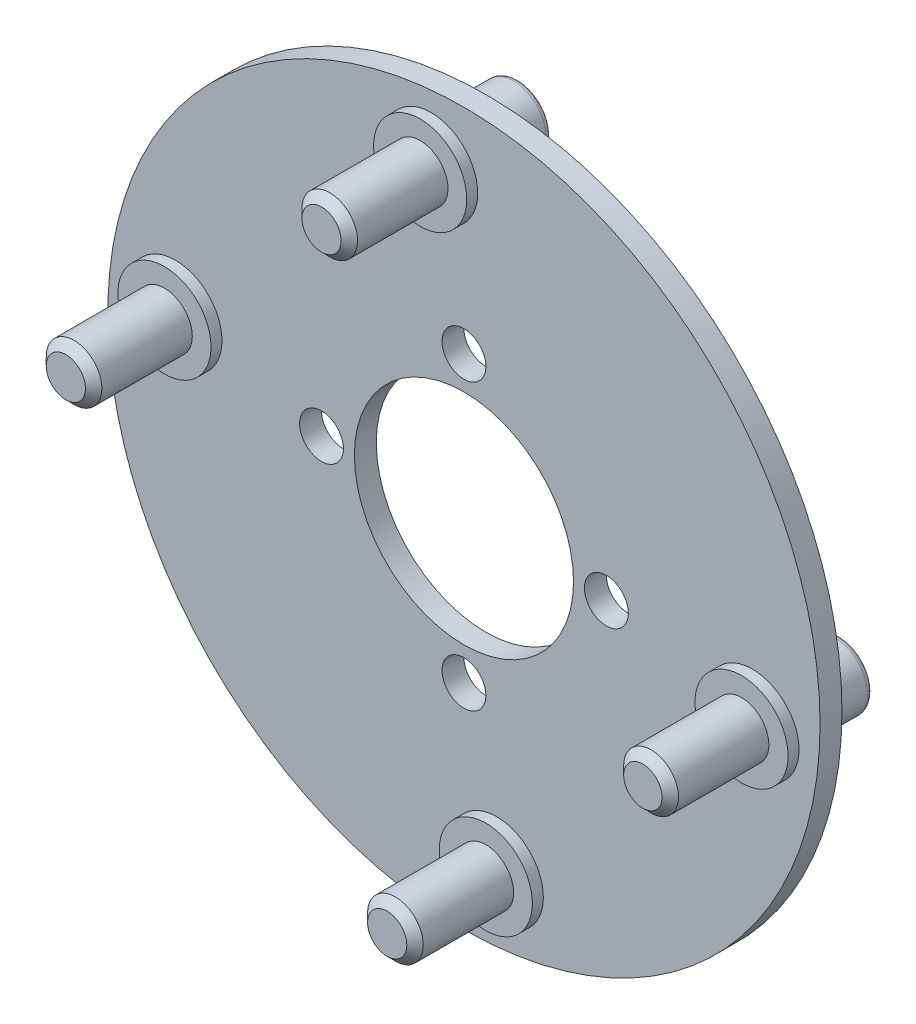
ISO-10303-21;
HEADER;
FILE_DESCRIPTION(('STEP AP214'),'2;1');
FILE_NAME('part.step','',(''),(''),'','','');
FILE_SCHEMA(('AUTOMOTIVE_DESIGN { 1 0 10303 214 1 1 1 1 }'));
ENDSEC;
DATA;
#1=APPLICATION_CONTEXT('core data for automotive mechanical design processes');
#2=APPLICATION_PROTOCOL_DEFINITION('international standard','automotive_design',2000,#1);
#3=PRODUCT_CONTEXT('',#1,'mechanical');
#4=PRODUCT('Part','Part','',(#3));
#5=PRODUCT_RELATED_PRODUCT_CATEGORY('part','',(#4));
#6=PRODUCT_DEFINITION_FORMATION('','',#4);
#7=PRODUCT_DEFINITION_CONTEXT('part definition',#1,'design');
#8=PRODUCT_DEFINITION('design','',#6,#7);
#9=PRODUCT_DEFINITION_SHAPE('','',#8);
#10=(LENGTH_UNIT() NAMED_UNIT(*) SI_UNIT(.MILLI.,.METRE.));
#11=(NAMED_UNIT(*) PLANE_ANGLE_UNIT() SI_UNIT($,.RADIAN.));
#12=(NAMED_UNIT(*) SI_UNIT($,.STERADIAN.) SOLID_ANGLE_UNIT());
#13=UNCERTAINTY_MEASURE_WITH_UNIT(LENGTH_MEASURE(1.E-05),#10,'distance_accuracy_value','');
#14=(GEOMETRIC_REPRESENTATION_CONTEXT(3) GLOBAL_UNCERTAINTY_ASSIGNED_CONTEXT((#13)) GLOBAL_UNIT_ASSIGNED_CONTEXT((#10,
#11,#12)) REPRESENTATION_CONTEXT('',''));
#15=CARTESIAN_POINT('',(0.,0.,0.));
#16=DIRECTION('',(0.,0.,1.));
#17=DIRECTION('',(1.,0.,0.));
#18=AXIS2_PLACEMENT_3D('',#15,#16,#17);
#19=CARTESIAN_POINT('',(2.9956164090372,-26.3301401881932,3.));
#20=DIRECTION('',(0.,0.,1.));
#21=DIRECTION('',(1.,0.,0.));
#22=AXIS2_PLACEMENT_3D('',#19,#20,#21);
#23=PLANE('',#22);
#24=CARTESIAN_POINT('',(2.9956164090372,-26.3301401881932,3.));
#25=DIRECTION('',(0.,0.,1.));
#26=DIRECTION('',(1.,0.,0.));
#27=AXIS2_PLACEMENT_3D('',#24,#25,#26);
#28=CIRCLE('',#27,4.25);
#29=CARTESIAN_POINT('',(7.2456164090372,-26.3301401881932,3.));
#30=VERTEX_POINT('',#29);
#31=EDGE_CURVE('E191',#30,#30,#28,.T.);
#32=ORIENTED_EDGE('',*,*,#31,.T.);
#33=EDGE_LOOP('',(#32));
#34=FACE_BOUND('',#33,.T.);
#35=CARTESIAN_POINT('',(2.9956164090372,-26.3301401881932,3.));
#36=DIRECTION('',(0.,0.,1.));
#37=DIRECTION('',(1.,0.,0.));
#38=AXIS2_PLACEMENT_3D('',#35,#36,#37);
#39=CIRCLE('',#38,2.53945180974883);
#40=CARTESIAN_POINT('',(5.53506821878603,-26.3301401881932,3.));
#41=VERTEX_POINT('',#40);
#42=EDGE_CURVE('E209',#41,#41,#39,.T.);
#43=ORIENTED_EDGE('',*,*,#42,.F.);
#44=EDGE_LOOP('',(#43));
#45=FACE_BOUND('',#44,.T.);
#46=ADVANCED_FACE('F36',(#34,#45),#23,.T.);
#47=CARTESIAN_POINT('',(-26.3301401881932,2.99561640903711,3.));
#48=DIRECTION('',(0.,0.,1.));
#49=DIRECTION('',(1.,0.,0.));
#50=AXIS2_PLACEMENT_3D('',#47,#48,#49);
#51=PLANE('',#50);
#52=CARTESIAN_POINT('',(-26.3301401881932,2.99561640903711,3.));
#53=DIRECTION('',(0.,0.,1.));
#54=DIRECTION('',(1.,0.,0.));
#55=AXIS2_PLACEMENT_3D('',#52,#53,#54);
#56=CIRCLE('',#55,4.25);
#57=CARTESIAN_POINT('',(-22.0801401881932,2.99561640903711,3.));
#58=VERTEX_POINT('',#57);
#59=EDGE_CURVE('E185',#58,#58,#56,.T.);
#60=ORIENTED_EDGE('',*,*,#59,.T.);
#61=EDGE_LOOP('',(#60));
#62=FACE_BOUND('',#61,.T.);
#63=CARTESIAN_POINT('',(-26.3301401881932,2.99561640903711,3.));
#64=DIRECTION('',(0.,0.,1.));
#65=DIRECTION('',(1.,0.,0.));
#66=AXIS2_PLACEMENT_3D('',#63,#64,#65);
#67=CIRCLE('',#66,2.53945180974883);
#68=CARTESIAN_POINT('',(-23.7906883784444,2.99561640903711,3.));
#69=VERTEX_POINT('',#68);
#70=EDGE_CURVE('E206',#69,#69,#67,.T.);
#71=ORIENTED_EDGE('',*,*,#70,.F.);
#72=EDGE_LOOP('',(#71));
#73=FACE_BOUND('',#72,.T.);
#74=ADVANCED_FACE('F216',(#62,#73),#51,.T.);
#75=CARTESIAN_POINT('',(26.3301401881932,-2.9956164090371,3.));
#76=DIRECTION('',(0.,0.,1.));
#77=DIRECTION('',(1.,0.,0.));
#78=AXIS2_PLACEMENT_3D('',#75,#76,#77);
#79=PLANE('',#78);
#80=CARTESIAN_POINT('',(26.3301401881932,-2.9956164090371,3.));
#81=DIRECTION('',(0.,0.,1.));
#82=DIRECTION('',(1.,0.,0.));
#83=AXIS2_PLACEMENT_3D('',#80,#81,#82);
#84=CIRCLE('',#83,4.25);
#85=CARTESIAN_POINT('',(30.5801401881932,-2.9956164090371,3.));
#86=VERTEX_POINT('',#85);
#87=EDGE_CURVE('E197',#86,#86,#84,.T.);
#88=ORIENTED_EDGE('',*,*,#87,.T.);
#89=EDGE_LOOP('',(#88));
#90=FACE_BOUND('',#89,.T.);
#91=CARTESIAN_POINT('',(26.3301401881932,-2.9956164090371,3.));
#92=DIRECTION('',(0.,0.,1.));
#93=DIRECTION('',(1.,0.,0.));
#94=AXIS2_PLACEMENT_3D('',#91,#92,#93);
#95=CIRCLE('',#94,2.5);
#96=CARTESIAN_POINT('',(28.8301401881932,-2.9956164090371,3.));
#97=VERTEX_POINT('',#96);
#98=EDGE_CURVE('E203',#97,#97,#95,.T.);
#99=ORIENTED_EDGE('',*,*,#98,.F.);
#100=EDGE_LOOP('',(#99));
#101=FACE_BOUND('',#100,.T.);
#102=ADVANCED_FACE('F222',(#90,#101),#79,.T.);
#103=CARTESIAN_POINT('',(-2.9956164090372,26.3301401881932,3.));
#104=DIRECTION('',(0.,0.,1.));
#105=DIRECTION('',(1.,0.,0.));
#106=AXIS2_PLACEMENT_3D('',#103,#104,#105);
#107=PLANE('',#106);
#108=CARTESIAN_POINT('',(-2.9956164090372,26.3301401881932,3.));
#109=DIRECTION('',(0.,0.,1.));
#110=DIRECTION('',(1.,0.,0.));
#111=AXIS2_PLACEMENT_3D('',#108,#109,#110);
#112=CIRCLE('',#111,4.25);
#113=CARTESIAN_POINT('',(1.2543835909628,26.3301401881932,3.));
#114=VERTEX_POINT('',#113);
#115=EDGE_CURVE('E179',#114,#114,#112,.T.);
#116=ORIENTED_EDGE('',*,*,#115,.T.);
#117=EDGE_LOOP('',(#116));
#118=FACE_BOUND('',#117,.T.);
#119=CARTESIAN_POINT('',(-2.9956164090372,26.3301401881932,3.));
#120=DIRECTION('',(0.,0.,1.));
#121=DIRECTION('',(1.,0.,0.));
#122=AXIS2_PLACEMENT_3D('',#119,#120,#121);
#123=CIRCLE('',#122,2.53945180974883);
#124=CARTESIAN_POINT('',(-0.456164599288373,26.3301401881932,3.));
#125=VERTEX_POINT('',#124);
#126=EDGE_CURVE('E200',#125,#125,#123,.T.);
#127=ORIENTED_EDGE('',*,*,#126,.F.);
#128=EDGE_LOOP('',(#127));
#129=FACE_BOUND('',#128,.T.);
#130=ADVANCED_FACE('F237',(#118,#129),#107,.T.);
#131=CARTESIAN_POINT('',(-26.3301401881932,2.99561640903711,-1.5));
#132=DIRECTION('',(0.,0.,1.));
#133=DIRECTION('',(1.,0.,0.));
#134=AXIS2_PLACEMENT_3D('',#131,#132,#133);
#135=PLANE('',#134);
#136=CARTESIAN_POINT('',(-26.3301401881932,2.99561640903711,-1.5));
#137=DIRECTION('',(0.,0.,1.));
#138=DIRECTION('',(1.,0.,0.));
#139=AXIS2_PLACEMENT_3D('',#136,#137,#138);
#140=CIRCLE('',#139,3.75);
#141=CARTESIAN_POINT('',(-22.5801401881932,2.99561640903711,-1.5));
#142=VERTEX_POINT('',#141);
#143=EDGE_CURVE('E104',#142,#142,#140,.F.);
#144=ORIENTED_EDGE('',*,*,#143,.T.);
#145=EDGE_LOOP('',(#144));
#146=FACE_BOUND('',#145,.T.);
#147=CARTESIAN_POINT('',(-26.3301401881932,2.99561640903711,-1.5));
#148=DIRECTION('',(0.,0.,1.));
#149=DIRECTION('',(1.,0.,0.));
#150=AXIS2_PLACEMENT_3D('',#147,#148,#149);
#151=CIRCLE('',#150,3.);
#152=CARTESIAN_POINT('',(-23.3301401881932,2.99561640903711,-1.5));
#153=VERTEX_POINT('',#152);
#154=EDGE_CURVE('E116',#153,#153,#151,.F.);
#155=ORIENTED_EDGE('',*,*,#154,.F.);
#156=EDGE_LOOP('',(#155));
#157=FACE_BOUND('',#156,.T.);
#158=ADVANCED_FACE('F235',(#146,#157),#135,.F.);
#159=CARTESIAN_POINT('',(2.9956164090372,-26.3301401881932,-1.5));
#160=DIRECTION('',(0.,0.,1.));
#161=DIRECTION('',(1.,0.,0.));
#162=AXIS2_PLACEMENT_3D('',#159,#160,#161);
#163=PLANE('',#162);
#164=CARTESIAN_POINT('',(2.9956164090372,-26.3301401881932,-1.5));
#165=DIRECTION('',(0.,0.,1.));
#166=DIRECTION('',(1.,0.,0.));
#167=AXIS2_PLACEMENT_3D('',#164,#165,#166);
#168=CIRCLE('',#167,3.75);
#169=CARTESIAN_POINT('',(6.7456164090372,-26.3301401881932,-1.5));
#170=VERTEX_POINT('',#169);
#171=EDGE_CURVE('E110',#170,#170,#168,.F.);
#172=ORIENTED_EDGE('',*,*,#171,.T.);
#173=EDGE_LOOP('',(#172));
#174=FACE_BOUND('',#173,.T.);
#175=CARTESIAN_POINT('',(2.9956164090372,-26.3301401881932,-1.5));
#176=DIRECTION('',(0.,0.,1.));
#177=DIRECTION('',(1.,0.,0.));
#178=AXIS2_PLACEMENT_3D('',#175,#176,#177);
#179=CIRCLE('',#178,3.);
#180=CARTESIAN_POINT('',(5.99561640903721,-26.3301401881932,-1.5));
#181=VERTEX_POINT('',#180);
#182=EDGE_CURVE('E119',#181,#181,#179,.F.);
#183=ORIENTED_EDGE('',*,*,#182,.F.);
#184=EDGE_LOOP('',(#183));
#185=FACE_BOUND('',#184,.T.);
#186=ADVANCED_FACE('F227',(#174,#185),#163,.F.);
#187=CARTESIAN_POINT('',(26.3301401881932,-2.9956164090371,-1.5));
#188=DIRECTION('',(0.,0.,1.));
#189=DIRECTION('',(1.,0.,0.));
#190=AXIS2_PLACEMENT_3D('',#187,#188,#189);
#191=PLANE('',#190);
#192=CARTESIAN_POINT('',(26.3301401881932,-2.9956164090371,-1.5));
#193=DIRECTION('',(0.,0.,1.));
#194=DIRECTION('',(1.,0.,0.));
#195=AXIS2_PLACEMENT_3D('',#192,#193,#194);
#196=CIRCLE('',#195,3.75);
#197=CARTESIAN_POINT('',(30.0801401881932,-2.9956164090371,-1.5));
#198=VERTEX_POINT('',#197);
#199=EDGE_CURVE('E92',#198,#198,#196,.F.);
#200=ORIENTED_EDGE('',*,*,#199,.T.);
#201=EDGE_LOOP('',(#200));
#202=FACE_BOUND('',#201,.T.);
#203=CARTESIAN_POINT('',(26.3301401881932,-2.9956164090371,-1.5));
#204=DIRECTION('',(0.,0.,1.));
#205=DIRECTION('',(1.,0.,0.));
#206=AXIS2_PLACEMENT_3D('',#203,#204,#205);
#207=CIRCLE('',#206,3.);
#208=CARTESIAN_POINT('',(29.3301401881932,-2.9956164090371,-1.5));
#209=VERTEX_POINT('',#208);
#210=EDGE_CURVE('E122',#209,#209,#207,.F.);
#211=ORIENTED_EDGE('',*,*,#210,.F.);
#212=EDGE_LOOP('',(#211));
#213=FACE_BOUND('',#212,.T.);
#214=ADVANCED_FACE('F249',(#202,#213),#191,.F.);
#215=CARTESIAN_POINT('',(-2.9956164090372,26.3301401881932,-1.5));
#216=DIRECTION('',(0.,0.,1.));
#217=DIRECTION('',(1.,0.,0.));
#218=AXIS2_PLACEMENT_3D('',#215,#216,#217);
#219=PLANE('',#218);
#220=CARTESIAN_POINT('',(-2.9956164090372,26.3301401881932,-1.5));
#221=DIRECTION('',(0.,0.,1.));
#222=DIRECTION('',(1.,0.,0.));
#223=AXIS2_PLACEMENT_3D('',#220,#221,#222);
#224=CIRCLE('',#223,3.75);
#225=CARTESIAN_POINT('',(0.754383590962801,26.3301401881932,-1.5));
#226=VERTEX_POINT('',#225);
#227=EDGE_CURVE('E98',#226,#226,#224,.F.);
#228=ORIENTED_EDGE('',*,*,#227,.T.);
#229=EDGE_LOOP('',(#228));
#230=FACE_BOUND('',#229,.T.);
#231=CARTESIAN_POINT('',(-2.9956164090372,26.3301401881932,-1.5));
#232=DIRECTION('',(0.,0.,1.));
#233=DIRECTION('',(1.,0.,0.));
#234=AXIS2_PLACEMENT_3D('',#231,#232,#233);
#235=CIRCLE('',#234,3.);
#236=CARTESIAN_POINT('',(0.00438359096280056,26.3301401881932,-1.5));
#237=VERTEX_POINT('',#236);
#238=EDGE_CURVE('E125',#237,#237,#235,.F.);
#239=ORIENTED_EDGE('',*,*,#238,.F.);
#240=EDGE_LOOP('',(#239));
#241=FACE_BOUND('',#240,.T.);
#242=ADVANCED_FACE('F245',(#230,#241),#219,.F.);
#243=CARTESIAN_POINT('',(0.,0.,2.));
#244=DIRECTION('',(0.,0.,1.));
#245=DIRECTION('',(1.,0.,0.));
#246=AXIS2_PLACEMENT_3D('',#243,#244,#245);
#247=PLANE('',#246);
#248=CARTESIAN_POINT('',(2.9956164090372,-26.3301401881932,2.));
#249=DIRECTION('',(0.,0.,1.));
#250=DIRECTION('',(1.,0.,0.));
#251=AXIS2_PLACEMENT_3D('',#248,#249,#250);
#252=CIRCLE('',#251,4.25);
#253=CARTESIAN_POINT('',(7.2456164090372,-26.3301401881932,2.));
#254=VERTEX_POINT('',#253);
#255=EDGE_CURVE('E188',#254,#254,#252,.F.);
#256=ORIENTED_EDGE('',*,*,#255,.T.);
#257=EDGE_LOOP('',(#256));
#258=FACE_BOUND('',#257,.T.);
#259=CARTESIAN_POINT('',(-2.9956164090372,26.3301401881932,2.));
#260=DIRECTION('',(0.,0.,1.));
#261=DIRECTION('',(1.,0.,0.));
#262=AXIS2_PLACEMENT_3D('',#259,#260,#261);
#263=CIRCLE('',#262,4.25);
#264=CARTESIAN_POINT('',(1.2543835909628,26.3301401881932,2.));
#265=VERTEX_POINT('',#264);
#266=EDGE_CURVE('E176',#265,#265,#263,.F.);
#267=ORIENTED_EDGE('',*,*,#266,.T.);
#268=EDGE_LOOP('',(#267));
#269=FACE_BOUND('',#268,.T.);
#270=CARTESIAN_POINT('',(-13.,1.36167851083266E-13,2.));
#271=DIRECTION('',(0.,0.,-1.));
#272=DIRECTION('',(0.,-1.,0.));
#273=AXIS2_PLACEMENT_3D('',#270,#271,#272);
#274=CIRCLE('',#273,2.);
#275=CARTESIAN_POINT('',(-13.,-1.99999999999986,2.));
#276=VERTEX_POINT('',#275);
#277=EDGE_CURVE('E170',#276,#276,#274,.T.);
#278=ORIENTED_EDGE('',*,*,#277,.T.);
#279=EDGE_LOOP('',(#278));
#280=FACE_BOUND('',#279,.T.);
#281=CARTESIAN_POINT('',(0.,-13.,2.));
#282=DIRECTION('',(0.,0.,-1.));
#283=DIRECTION('',(1.,0.,0.));
#284=AXIS2_PLACEMENT_3D('',#281,#282,#283);
#285=CIRCLE('',#284,2.);
#286=CARTESIAN_POINT('',(1.99999999999991,-13.,2.));
#287=VERTEX_POINT('',#286);
#288=EDGE_CURVE('E164',#287,#287,#285,.T.);
#289=ORIENTED_EDGE('',*,*,#288,.T.);
#290=EDGE_LOOP('',(#289));
#291=FACE_BOUND('',#290,.T.);
#292=CARTESIAN_POINT('',(13.,0.,2.));
#293=DIRECTION('',(0.,0.,-1.));
#294=DIRECTION('',(0.,1.,0.));
#295=AXIS2_PLACEMENT_3D('',#292,#293,#294);
#296=CIRCLE('',#295,2.);
#297=CARTESIAN_POINT('',(13.,1.99999999999995,2.));
#298=VERTEX_POINT('',#297);
#299=EDGE_CURVE('E158',#298,#298,#296,.T.);
#300=ORIENTED_EDGE('',*,*,#299,.T.);
#301=EDGE_LOOP('',(#300));
#302=FACE_BOUND('',#301,.T.);
#303=CARTESIAN_POINT('',(0.,13.,2.));
#304=DIRECTION('',(0.,0.,-1.));
#305=DIRECTION('',(-1.,0.,0.));
#306=AXIS2_PLACEMENT_3D('',#303,#304,#305);
#307=CIRCLE('',#306,2.);
#308=CARTESIAN_POINT('',(-2.,13.,2.));
#309=VERTEX_POINT('',#308);
#310=EDGE_CURVE('E152',#309,#309,#307,.T.);
#311=ORIENTED_EDGE('',*,*,#310,.T.);
#312=EDGE_LOOP('',(#311));
#313=FACE_BOUND('',#312,.T.);
#314=CARTESIAN_POINT('',(0.,0.,2.));
#315=DIRECTION('',(0.,0.,1.));
#316=DIRECTION('',(1.,0.,0.));
#317=AXIS2_PLACEMENT_3D('',#314,#315,#316);
#318=CIRCLE('',#317,32.5);
#319=CARTESIAN_POINT('',(32.5,0.,2.));
#320=VERTEX_POINT('',#319);
#321=EDGE_CURVE('E140',#320,#320,#318,.T.);
#322=ORIENTED_EDGE('',*,*,#321,.T.);
#323=EDGE_LOOP('',(#322));
#324=FACE_BOUND('',#323,.T.);
#325=CARTESIAN_POINT('',(0.,0.,2.));
#326=DIRECTION('',(0.,0.,1.));
#327=DIRECTION('',(1.,0.,0.));
#328=AXIS2_PLACEMENT_3D('',#325,#326,#327);
#329=CIRCLE('',#328,10.);
#330=CARTESIAN_POINT('',(10.,0.,2.));
#331=VERTEX_POINT('',#330);
#332=EDGE_CURVE('E146',#331,#331,#329,.T.);
#333=ORIENTED_EDGE('',*,*,#332,.F.);
#334=EDGE_LOOP('',(#333));
#335=FACE_BOUND('',#334,.T.);
#336=CARTESIAN_POINT('',(-26.3301401881932,2.99561640903711,2.));
#337=DIRECTION('',(0.,0.,1.));
#338=DIRECTION('',(1.,0.,0.));
#339=AXIS2_PLACEMENT_3D('',#336,#337,#338);
#340=CIRCLE('',#339,4.25);
#341=CARTESIAN_POINT('',(-22.0801401881932,2.99561640903711,2.));
#342=VERTEX_POINT('',#341);
#343=EDGE_CURVE('E182',#342,#342,#340,.F.);
#344=ORIENTED_EDGE('',*,*,#343,.T.);
#345=EDGE_LOOP('',(#344));
#346=FACE_BOUND('',#345,.T.);
#347=CARTESIAN_POINT('',(26.3301401881932,-2.9956164090371,2.));
#348=DIRECTION('',(0.,0.,1.));
#349=DIRECTION('',(1.,0.,0.));
#350=AXIS2_PLACEMENT_3D('',#347,#348,#349);
#351=CIRCLE('',#350,4.25);
#352=CARTESIAN_POINT('',(30.5801401881932,-2.9956164090371,2.));
#353=VERTEX_POINT('',#352);
#354=EDGE_CURVE('E194',#353,#353,#351,.F.);
#355=ORIENTED_EDGE('',*,*,#354,.T.);
#356=EDGE_LOOP('',(#355));
#357=FACE_BOUND('',#356,.T.);
#358=ADVANCED_FACE('F248',(#258,#269,#280,#291,#302,#313,#324,#335,#346,#357),#247,.T.);
#359=CARTESIAN_POINT('',(0.,0.,0.));
#360=DIRECTION('',(0.,0.,1.));
#361=DIRECTION('',(1.,0.,0.));
#362=AXIS2_PLACEMENT_3D('',#359,#360,#361);
#363=PLANE('',#362);
#364=CARTESIAN_POINT('',(2.9956164090372,-26.3301401881932,0.));
#365=DIRECTION('',(0.,0.,1.));
#366=DIRECTION('',(1.,0.,0.));
#367=AXIS2_PLACEMENT_3D('',#364,#365,#366);
#368=CIRCLE('',#367,4.25);
#369=CARTESIAN_POINT('',(7.2456164090372,-26.3301401881932,0.));
#370=VERTEX_POINT('',#369);
#371=EDGE_CURVE('E131',#370,#370,#368,.F.);
#372=ORIENTED_EDGE('',*,*,#371,.F.);
#373=EDGE_LOOP('',(#372));
#374=FACE_BOUND('',#373,.T.);
#375=CARTESIAN_POINT('',(-2.9956164090372,26.3301401881932,0.));
#376=DIRECTION('',(0.,0.,1.));
#377=DIRECTION('',(1.,0.,0.));
#378=AXIS2_PLACEMENT_3D('',#375,#376,#377);
#379=CIRCLE('',#378,4.25);
#380=CARTESIAN_POINT('',(1.2543835909628,26.3301401881932,0.));
#381=VERTEX_POINT('',#380);
#382=EDGE_CURVE('E137',#381,#381,#379,.F.);
#383=ORIENTED_EDGE('',*,*,#382,.F.);
#384=EDGE_LOOP('',(#383));
#385=FACE_BOUND('',#384,.T.);
#386=CARTESIAN_POINT('',(-13.,1.36167851083266E-13,0.));
#387=DIRECTION('',(0.,0.,-1.));
#388=DIRECTION('',(0.,-1.,0.));
#389=AXIS2_PLACEMENT_3D('',#386,#387,#388);
#390=CIRCLE('',#389,2.);
#391=CARTESIAN_POINT('',(-13.,-1.99999999999986,0.));
#392=VERTEX_POINT('',#391);
#393=EDGE_CURVE('E173',#392,#392,#390,.T.);
#394=ORIENTED_EDGE('',*,*,#393,.F.);
#395=EDGE_LOOP('',(#394));
#396=FACE_BOUND('',#395,.T.);
#397=CARTESIAN_POINT('',(0.,-13.,0.));
#398=DIRECTION('',(0.,0.,-1.));
#399=DIRECTION('',(1.,0.,0.));
#400=AXIS2_PLACEMENT_3D('',#397,#398,#399);
#401=CIRCLE('',#400,2.);
#402=CARTESIAN_POINT('',(1.99999999999991,-13.,0.));
#403=VERTEX_POINT('',#402);
#404=EDGE_CURVE('E167',#403,#403,#401,.T.);
#405=ORIENTED_EDGE('',*,*,#404,.F.);
#406=EDGE_LOOP('',(#405));
#407=FACE_BOUND('',#406,.T.);
#408=CARTESIAN_POINT('',(13.,0.,0.));
#409=DIRECTION('',(0.,0.,-1.));
#410=DIRECTION('',(0.,1.,0.));
#411=AXIS2_PLACEMENT_3D('',#408,#409,#410);
#412=CIRCLE('',#411,2.);
#413=CARTESIAN_POINT('',(13.,1.99999999999995,0.));
#414=VERTEX_POINT('',#413);
#415=EDGE_CURVE('E161',#414,#414,#412,.T.);
#416=ORIENTED_EDGE('',*,*,#415,.F.);
#417=EDGE_LOOP('',(#416));
#418=FACE_BOUND('',#417,.T.);
#419=CARTESIAN_POINT('',(0.,13.,0.));
#420=DIRECTION('',(0.,0.,-1.));
#421=DIRECTION('',(-1.,0.,0.));
#422=AXIS2_PLACEMENT_3D('',#419,#420,#421);
#423=CIRCLE('',#422,2.);
#424=CARTESIAN_POINT('',(-2.,13.,0.));
#425=VERTEX_POINT('',#424);
#426=EDGE_CURVE('E155',#425,#425,#423,.T.);
#427=ORIENTED_EDGE('',*,*,#426,.F.);
#428=EDGE_LOOP('',(#427));
#429=FACE_BOUND('',#428,.T.);
#430=CARTESIAN_POINT('',(0.,0.,0.));
#431=DIRECTION('',(0.,0.,1.));
#432=DIRECTION('',(1.,0.,0.));
#433=AXIS2_PLACEMENT_3D('',#430,#431,#432);
#434=CIRCLE('',#433,32.5);
#435=CARTESIAN_POINT('',(32.5,0.,0.));
#436=VERTEX_POINT('',#435);
#437=EDGE_CURVE('E143',#436,#436,#434,.T.);
#438=ORIENTED_EDGE('',*,*,#437,.F.);
#439=EDGE_LOOP('',(#438));
#440=FACE_BOUND('',#439,.T.);
#441=CARTESIAN_POINT('',(0.,0.,0.));
#442=DIRECTION('',(0.,0.,1.));
#443=DIRECTION('',(1.,0.,0.));
#444=AXIS2_PLACEMENT_3D('',#441,#442,#443);
#445=CIRCLE('',#444,10.);
#446=CARTESIAN_POINT('',(10.,0.,0.));
#447=VERTEX_POINT('',#446);
#448=EDGE_CURVE('E149',#447,#447,#445,.T.);
#449=ORIENTED_EDGE('',*,*,#448,.T.);
#450=EDGE_LOOP('',(#449));
#451=FACE_BOUND('',#450,.T.);
#452=CARTESIAN_POINT('',(-26.3301401881932,2.99561640903711,0.));
#453=DIRECTION('',(0.,0.,1.));
#454=DIRECTION('',(1.,0.,0.));
#455=AXIS2_PLACEMENT_3D('',#452,#453,#454);
#456=CIRCLE('',#455,4.25);
#457=CARTESIAN_POINT('',(-22.0801401881932,2.99561640903711,0.));
#458=VERTEX_POINT('',#457);
#459=EDGE_CURVE('E134',#458,#458,#456,.F.);
#460=ORIENTED_EDGE('',*,*,#459,.F.);
#461=EDGE_LOOP('',(#460));
#462=FACE_BOUND('',#461,.T.);
#463=CARTESIAN_POINT('',(26.3301401881932,-2.9956164090371,0.));
#464=DIRECTION('',(0.,0.,1.));
#465=DIRECTION('',(1.,0.,0.));
#466=AXIS2_PLACEMENT_3D('',#463,#464,#465);
#467=CIRCLE('',#466,4.25);
#468=CARTESIAN_POINT('',(30.5801401881932,-2.9956164090371,0.));
#469=VERTEX_POINT('',#468);
#470=EDGE_CURVE('E128',#469,#469,#467,.F.);
#471=ORIENTED_EDGE('',*,*,#470,.F.);
#472=EDGE_LOOP('',(#471));
#473=FACE_BOUND('',#472,.T.);
#474=ADVANCED_FACE('F279',(#374,#385,#396,#407,#418,#429,#440,#451,#462,#473),#363,.F.);
#475=CARTESIAN_POINT('',(0.,0.,2.));
#476=DIRECTION('',(0.,0.,-1.));
#477=DIRECTION('',(-1.,0.,0.));
#478=AXIS2_PLACEMENT_3D('',#475,#476,#477);
#479=CYLINDRICAL_SURFACE('',#478,32.5);
#480=ORIENTED_EDGE('',*,*,#321,.F.);
#481=EDGE_LOOP('',(#480));
#482=FACE_BOUND('',#481,.T.);
#483=ORIENTED_EDGE('',*,*,#437,.T.);
#484=EDGE_LOOP('',(#483));
#485=FACE_BOUND('',#484,.T.);
#486=ADVANCED_FACE('F38',(#482,#485),#479,.T.);
#487=CARTESIAN_POINT('',(0.,0.,2.));
#488=DIRECTION('',(0.,0.,-1.));
#489=DIRECTION('',(-1.,0.,0.));
#490=AXIS2_PLACEMENT_3D('',#487,#488,#489);
#491=CYLINDRICAL_SURFACE('',#490,10.);
#492=ORIENTED_EDGE('',*,*,#332,.T.);
#493=EDGE_LOOP('',(#492));
#494=FACE_BOUND('',#493,.T.);
#495=ORIENTED_EDGE('',*,*,#448,.F.);
#496=EDGE_LOOP('',(#495));
#497=FACE_BOUND('',#496,.T.);
#498=ADVANCED_FACE('F274',(#494,#497),#491,.F.);
#499=CARTESIAN_POINT('',(0.,13.,2.));
#500=DIRECTION('',(0.,0.,-1.));
#501=DIRECTION('',(-1.,0.,0.));
#502=AXIS2_PLACEMENT_3D('',#499,#500,#501);
#503=CYLINDRICAL_SURFACE('',#502,2.);
#504=ORIENTED_EDGE('',*,*,#310,.F.);
#505=EDGE_LOOP('',(#504));
#506=FACE_BOUND('',#505,.T.);
#507=ORIENTED_EDGE('',*,*,#426,.T.);
#508=EDGE_LOOP('',(#507));
#509=FACE_BOUND('',#508,.T.);
#510=ADVANCED_FACE('F270',(#506,#509),#503,.F.);
#511=CARTESIAN_POINT('',(13.,0.,2.));
#512=DIRECTION('',(0.,0.,-1.));
#513=DIRECTION('',(-1.,0.,0.));
#514=AXIS2_PLACEMENT_3D('',#511,#512,#513);
#515=CYLINDRICAL_SURFACE('',#514,2.);
#516=ORIENTED_EDGE('',*,*,#299,.F.);
#517=EDGE_LOOP('',(#516));
#518=FACE_BOUND('',#517,.T.);
#519=ORIENTED_EDGE('',*,*,#415,.T.);
#520=EDGE_LOOP('',(#519));
#521=FACE_BOUND('',#520,.T.);
#522=ADVANCED_FACE('F266',(#518,#521),#515,.F.);
#523=CARTESIAN_POINT('',(0.,-13.,2.));
#524=DIRECTION('',(0.,0.,-1.));
#525=DIRECTION('',(-1.,0.,0.));
#526=AXIS2_PLACEMENT_3D('',#523,#524,#525);
#527=CYLINDRICAL_SURFACE('',#526,2.);
#528=ORIENTED_EDGE('',*,*,#288,.F.);
#529=EDGE_LOOP('',(#528));
#530=FACE_BOUND('',#529,.T.);
#531=ORIENTED_EDGE('',*,*,#404,.T.);
#532=EDGE_LOOP('',(#531));
#533=FACE_BOUND('',#532,.T.);
#534=ADVANCED_FACE('F262',(#530,#533),#527,.F.);
#535=CARTESIAN_POINT('',(-13.,1.36167851083266E-13,2.));
#536=DIRECTION('',(0.,0.,-1.));
#537=DIRECTION('',(-1.,0.,0.));
#538=AXIS2_PLACEMENT_3D('',#535,#536,#537);
#539=CYLINDRICAL_SURFACE('',#538,2.);
#540=ORIENTED_EDGE('',*,*,#277,.F.);
#541=EDGE_LOOP('',(#540));
#542=FACE_BOUND('',#541,.T.);
#543=ORIENTED_EDGE('',*,*,#393,.T.);
#544=EDGE_LOOP('',(#543));
#545=FACE_BOUND('',#544,.T.);
#546=ADVANCED_FACE('F259',(#542,#545),#539,.F.);
#547=CARTESIAN_POINT('',(-2.9956164090372,26.3301401881932,3.));
#548=DIRECTION('',(0.,0.,-1.));
#549=DIRECTION('',(-1.,0.,0.));
#550=AXIS2_PLACEMENT_3D('',#547,#548,#549);
#551=CYLINDRICAL_SURFACE('',#550,4.25);
#552=CARTESIAN_POINT('',(-2.9956164090372,26.3301401881932,-1.));
#553=DIRECTION('',(0.,0.,1.));
#554=DIRECTION('',(1.,0.,0.));
#555=AXIS2_PLACEMENT_3D('',#552,#553,#554);
#556=CIRCLE('',#555,4.25);
#557=CARTESIAN_POINT('',(1.2543835909628,26.3301401881932,-1.));
#558=VERTEX_POINT('',#557);
#559=EDGE_CURVE('E101',#558,#558,#556,.T.);
#560=ORIENTED_EDGE('',*,*,#559,.T.);
#561=EDGE_LOOP('',(#560));
#562=FACE_BOUND('',#561,.T.);
#563=ORIENTED_EDGE('',*,*,#382,.T.);
#564=EDGE_LOOP('',(#563));
#565=FACE_BOUND('',#564,.T.);
#566=ADVANCED_FACE('F257',(#562,#565),#551,.T.);
#567=ORIENTED_EDGE('',*,*,#266,.F.);
#568=EDGE_LOOP('',(#567));
#569=FACE_BOUND('',#568,.T.);
#570=ORIENTED_EDGE('',*,*,#115,.F.);
#571=EDGE_LOOP('',(#570));
#572=FACE_BOUND('',#571,.T.);
#573=ADVANCED_FACE('F254',(#569,#572),#551,.T.);
#574=CARTESIAN_POINT('',(-26.3301401881932,2.99561640903711,3.));
#575=DIRECTION('',(0.,0.,-1.));
#576=DIRECTION('',(-1.,0.,0.));
#577=AXIS2_PLACEMENT_3D('',#574,#575,#576);
#578=CYLINDRICAL_SURFACE('',#577,4.25);
#579=CARTESIAN_POINT('',(-26.3301401881932,2.99561640903711,-1.));
#580=DIRECTION('',(0.,0.,1.));
#581=DIRECTION('',(1.,0.,0.));
#582=AXIS2_PLACEMENT_3D('',#579,#580,#581);
#583=CIRCLE('',#582,4.25);
#584=CARTESIAN_POINT('',(-22.0801401881932,2.99561640903711,-1.));
#585=VERTEX_POINT('',#584);
#586=EDGE_CURVE('E107',#585,#585,#583,.T.);
#587=ORIENTED_EDGE('',*,*,#586,.T.);
#588=EDGE_LOOP('',(#587));
#589=FACE_BOUND('',#588,.T.);
#590=ORIENTED_EDGE('',*,*,#459,.T.);
#591=EDGE_LOOP('',(#590));
#592=FACE_BOUND('',#591,.T.);
#593=ADVANCED_FACE('F243',(#589,#592),#578,.T.);
#594=ORIENTED_EDGE('',*,*,#343,.F.);
#595=EDGE_LOOP('',(#594));
#596=FACE_BOUND('',#595,.T.);
#597=ORIENTED_EDGE('',*,*,#59,.F.);
#598=EDGE_LOOP('',(#597));
#599=FACE_BOUND('',#598,.T.);
#600=ADVANCED_FACE('F240',(#596,#599),#578,.T.);
#601=CARTESIAN_POINT('',(2.9956164090372,-26.3301401881932,3.));
#602=DIRECTION('',(0.,0.,-1.));
#603=DIRECTION('',(-1.,0.,0.));
#604=AXIS2_PLACEMENT_3D('',#601,#602,#603);
#605=CYLINDRICAL_SURFACE('',#604,4.25);
#606=CARTESIAN_POINT('',(2.9956164090372,-26.3301401881932,-1.));
#607=DIRECTION('',(0.,0.,1.));
#608=DIRECTION('',(1.,0.,0.));
#609=AXIS2_PLACEMENT_3D('',#606,#607,#608);
#610=CIRCLE('',#609,4.25);
#611=CARTESIAN_POINT('',(7.2456164090372,-26.3301401881932,-1.));
#612=VERTEX_POINT('',#611);
#613=EDGE_CURVE('E113',#612,#612,#610,.T.);
#614=ORIENTED_EDGE('',*,*,#613,.T.);
#615=EDGE_LOOP('',(#614));
#616=FACE_BOUND('',#615,.T.);
#617=ORIENTED_EDGE('',*,*,#371,.T.);
#618=EDGE_LOOP('',(#617));
#619=FACE_BOUND('',#618,.T.);
#620=ADVANCED_FACE('F233',(#616,#619),#605,.T.);
#621=ORIENTED_EDGE('',*,*,#255,.F.);
#622=EDGE_LOOP('',(#621));
#623=FACE_BOUND('',#622,.T.);
#624=ORIENTED_EDGE('',*,*,#31,.F.);
#625=EDGE_LOOP('',(#624));
#626=FACE_BOUND('',#625,.T.);
#627=ADVANCED_FACE('F229',(#623,#626),#605,.T.);
#628=CARTESIAN_POINT('',(26.3301401881932,-2.9956164090371,3.));
#629=DIRECTION('',(0.,0.,-1.));
#630=DIRECTION('',(-1.,0.,0.));
#631=AXIS2_PLACEMENT_3D('',#628,#629,#630);
#632=CYLINDRICAL_SURFACE('',#631,4.25);
#633=CARTESIAN_POINT('',(26.3301401881932,-2.9956164090371,-1.));
#634=DIRECTION('',(0.,0.,1.));
#635=DIRECTION('',(1.,0.,0.));
#636=AXIS2_PLACEMENT_3D('',#633,#634,#635);
#637=CIRCLE('',#636,4.25);
#638=CARTESIAN_POINT('',(30.5801401881932,-2.9956164090371,-1.));
#639=VERTEX_POINT('',#638);
#640=EDGE_CURVE('E95',#639,#639,#637,.T.);
#641=ORIENTED_EDGE('',*,*,#640,.T.);
#642=EDGE_LOOP('',(#641));
#643=FACE_BOUND('',#642,.T.);
#644=ORIENTED_EDGE('',*,*,#470,.T.);
#645=EDGE_LOOP('',(#644));
#646=FACE_BOUND('',#645,.T.);
#647=ADVANCED_FACE('F232',(#643,#646),#632,.T.);
#648=ORIENTED_EDGE('',*,*,#354,.F.);
#649=EDGE_LOOP('',(#648));
#650=FACE_BOUND('',#649,.T.);
#651=ORIENTED_EDGE('',*,*,#87,.F.);
#652=EDGE_LOOP('',(#651));
#653=FACE_BOUND('',#652,.T.);
#654=ADVANCED_FACE('F306',(#650,#653),#632,.T.);
#655=CARTESIAN_POINT('',(-2.9956164090372,26.3301401881932,-6.));
#656=DIRECTION('',(0.,0.,1.));
#657=DIRECTION('',(1.,0.,0.));
#658=AXIS2_PLACEMENT_3D('',#655,#656,#657);
#659=CYLINDRICAL_SURFACE('',#658,3.);
#660=CARTESIAN_POINT('',(-2.9956164090372,26.3301401881932,-5.5));
#661=DIRECTION('',(0.,0.,-1.));
#662=DIRECTION('',(-1.,0.,0.));
#663=AXIS2_PLACEMENT_3D('',#660,#661,#662);
#664=CIRCLE('',#663,3.);
#665=CARTESIAN_POINT('',(-5.9956164090372,26.3301401881932,-5.5));
#666=VERTEX_POINT('',#665);
#667=EDGE_CURVE('E68',#666,#666,#664,.F.);
#668=ORIENTED_EDGE('',*,*,#667,.T.);
#669=EDGE_LOOP('',(#668));
#670=FACE_BOUND('',#669,.T.);
#671=ORIENTED_EDGE('',*,*,#238,.T.);
#672=EDGE_LOOP('',(#671));
#673=FACE_BOUND('',#672,.T.);
#674=ADVANCED_FACE('F309',(#670,#673),#659,.T.);
#675=CARTESIAN_POINT('',(-2.9956164090372,26.3301401881932,-6.));
#676=DIRECTION('',(0.,0.,-1.));
#677=DIRECTION('',(-1.,0.,0.));
#678=AXIS2_PLACEMENT_3D('',#675,#676,#677);
#679=PLANE('',#678);
#680=CARTESIAN_POINT('',(-2.9956164090372,26.3301401881932,-6.));
#681=DIRECTION('',(0.,0.,-1.));
#682=DIRECTION('',(-1.,0.,0.));
#683=AXIS2_PLACEMENT_3D('',#680,#681,#682);
#684=CIRCLE('',#683,2.5);
#685=CARTESIAN_POINT('',(-5.4956164090372,26.3301401881932,-6.));
#686=VERTEX_POINT('',#685);
#687=EDGE_CURVE('E71',#686,#686,#684,.T.);
#688=ORIENTED_EDGE('',*,*,#687,.T.);
#689=EDGE_LOOP('',(#688));
#690=FACE_BOUND('',#689,.T.);
#691=ADVANCED_FACE('F391',(#690),#679,.T.);
#692=CARTESIAN_POINT('',(26.3301401881932,-2.9956164090371,-6.));
#693=DIRECTION('',(0.,0.,1.));
#694=DIRECTION('',(1.,0.,0.));
#695=AXIS2_PLACEMENT_3D('',#692,#693,#694);
#696=CYLINDRICAL_SURFACE('',#695,3.);
#697=CARTESIAN_POINT('',(26.3301401881932,-2.9956164090371,-5.5));
#698=DIRECTION('',(0.,0.,-1.));
#699=DIRECTION('',(-1.,0.,0.));
#700=AXIS2_PLACEMENT_3D('',#697,#698,#699);
#701=CIRCLE('',#700,3.);
#702=CARTESIAN_POINT('',(23.3301401881932,-2.9956164090371,-5.5));
#703=VERTEX_POINT('',#702);
#704=EDGE_CURVE('E74',#703,#703,#701,.F.);
#705=ORIENTED_EDGE('',*,*,#704,.T.);
#706=EDGE_LOOP('',(#705));
#707=FACE_BOUND('',#706,.T.);
#708=ORIENTED_EDGE('',*,*,#210,.T.);
#709=EDGE_LOOP('',(#708));
#710=FACE_BOUND('',#709,.T.);
#711=ADVANCED_FACE('F387',(#707,#710),#696,.T.);
#712=CARTESIAN_POINT('',(26.3301401881932,-2.9956164090371,-6.));
#713=DIRECTION('',(0.,0.,-1.));
#714=DIRECTION('',(-1.,0.,0.));
#715=AXIS2_PLACEMENT_3D('',#712,#713,#714);
#716=PLANE('',#715);
#717=CARTESIAN_POINT('',(26.3301401881932,-2.9956164090371,-6.));
#718=DIRECTION('',(0.,0.,-1.));
#719=DIRECTION('',(-1.,0.,0.));
#720=AXIS2_PLACEMENT_3D('',#717,#718,#719);
#721=CIRCLE('',#720,2.5);
#722=CARTESIAN_POINT('',(23.8301401881932,-2.9956164090371,-6.));
#723=VERTEX_POINT('',#722);
#724=EDGE_CURVE('E77',#723,#723,#721,.T.);
#725=ORIENTED_EDGE('',*,*,#724,.T.);
#726=EDGE_LOOP('',(#725));
#727=FACE_BOUND('',#726,.T.);
#728=ADVANCED_FACE('F383',(#727),#716,.T.);
#729=CARTESIAN_POINT('',(2.9956164090372,-26.3301401881932,-6.));
#730=DIRECTION('',(0.,0.,1.));
#731=DIRECTION('',(1.,0.,0.));
#732=AXIS2_PLACEMENT_3D('',#729,#730,#731);
#733=CYLINDRICAL_SURFACE('',#732,3.);
#734=CARTESIAN_POINT('',(2.9956164090372,-26.3301401881932,-5.5));
#735=DIRECTION('',(0.,0.,-1.));
#736=DIRECTION('',(-1.,0.,0.));
#737=AXIS2_PLACEMENT_3D('',#734,#735,#736);
#738=CIRCLE('',#737,3.);
#739=CARTESIAN_POINT('',(-0.00438359096279536,-26.3301401881932,-5.5));
#740=VERTEX_POINT('',#739);
#741=EDGE_CURVE('E80',#740,#740,#738,.F.);
#742=ORIENTED_EDGE('',*,*,#741,.T.);
#743=EDGE_LOOP('',(#742));
#744=FACE_BOUND('',#743,.T.);
#745=ORIENTED_EDGE('',*,*,#182,.T.);
#746=EDGE_LOOP('',(#745));
#747=FACE_BOUND('',#746,.T.);
#748=ADVANCED_FACE('F379',(#744,#747),#733,.T.);
#749=CARTESIAN_POINT('',(2.9956164090372,-26.3301401881932,-6.));
#750=DIRECTION('',(0.,0.,-1.));
#751=DIRECTION('',(-1.,0.,0.));
#752=AXIS2_PLACEMENT_3D('',#749,#750,#751);
#753=PLANE('',#752);
#754=CARTESIAN_POINT('',(2.9956164090372,-26.3301401881932,-6.));
#755=DIRECTION('',(0.,0.,-1.));
#756=DIRECTION('',(-1.,0.,0.));
#757=AXIS2_PLACEMENT_3D('',#754,#755,#756);
#758=CIRCLE('',#757,2.5);
#759=CARTESIAN_POINT('',(0.495616409037205,-26.3301401881932,-6.));
#760=VERTEX_POINT('',#759);
#761=EDGE_CURVE('E83',#760,#760,#758,.T.);
#762=ORIENTED_EDGE('',*,*,#761,.T.);
#763=EDGE_LOOP('',(#762));
#764=FACE_BOUND('',#763,.T.);
#765=ADVANCED_FACE('F375',(#764),#753,.T.);
#766=CARTESIAN_POINT('',(-26.3301401881932,2.99561640903711,-6.));
#767=DIRECTION('',(0.,0.,1.));
#768=DIRECTION('',(1.,0.,0.));
#769=AXIS2_PLACEMENT_3D('',#766,#767,#768);
#770=CYLINDRICAL_SURFACE('',#769,3.);
#771=CARTESIAN_POINT('',(-26.3301401881932,2.99561640903711,-5.5));
#772=DIRECTION('',(0.,0.,-1.));
#773=DIRECTION('',(-1.,0.,0.));
#774=AXIS2_PLACEMENT_3D('',#771,#772,#773);
#775=CIRCLE('',#774,3.);
#776=CARTESIAN_POINT('',(-29.3301401881932,2.99561640903711,-5.5));
#777=VERTEX_POINT('',#776);
#778=EDGE_CURVE('E86',#777,#777,#775,.F.);
#779=ORIENTED_EDGE('',*,*,#778,.T.);
#780=EDGE_LOOP('',(#779));
#781=FACE_BOUND('',#780,.T.);
#782=ORIENTED_EDGE('',*,*,#154,.T.);
#783=EDGE_LOOP('',(#782));
#784=FACE_BOUND('',#783,.T.);
#785=ADVANCED_FACE('F371',(#781,#784),#770,.T.);
#786=CARTESIAN_POINT('',(-26.3301401881932,2.99561640903711,-6.));
#787=DIRECTION('',(0.,0.,-1.));
#788=DIRECTION('',(-1.,0.,0.));
#789=AXIS2_PLACEMENT_3D('',#786,#787,#788);
#790=PLANE('',#789);
#791=CARTESIAN_POINT('',(-26.3301401881932,2.99561640903711,-6.));
#792=DIRECTION('',(0.,0.,-1.));
#793=DIRECTION('',(-1.,0.,0.));
#794=AXIS2_PLACEMENT_3D('',#791,#792,#793);
#795=CIRCLE('',#794,2.5);
#796=CARTESIAN_POINT('',(-28.8301401881932,2.99561640903711,-6.));
#797=VERTEX_POINT('',#796);
#798=EDGE_CURVE('E89',#797,#797,#795,.T.);
#799=ORIENTED_EDGE('',*,*,#798,.T.);
#800=EDGE_LOOP('',(#799));
#801=FACE_BOUND('',#800,.T.);
#802=ADVANCED_FACE('F367',(#801),#790,.T.);
#803=CARTESIAN_POINT('',(2.9956164090372,-26.3301401881932,-1.));
#804=DIRECTION('',(0.,0.,1.));
#805=DIRECTION('',(1.,0.,0.));
#806=AXIS2_PLACEMENT_3D('',#803,#804,#805);
#807=TOROIDAL_SURFACE('',#806,3.75,0.5);
#808=ORIENTED_EDGE('',*,*,#171,.F.);
#809=EDGE_LOOP('',(#808));
#810=FACE_BOUND('',#809,.T.);
#811=ORIENTED_EDGE('',*,*,#613,.F.);
#812=EDGE_LOOP('',(#811));
#813=FACE_BOUND('',#812,.T.);
#814=ADVANCED_FACE('F363',(#810,#813),#807,.T.);
#815=CARTESIAN_POINT('',(-26.3301401881932,2.99561640903711,-1.));
#816=DIRECTION('',(0.,0.,1.));
#817=DIRECTION('',(1.,0.,0.));
#818=AXIS2_PLACEMENT_3D('',#815,#816,#817);
#819=TOROIDAL_SURFACE('',#818,3.75,0.5);
#820=ORIENTED_EDGE('',*,*,#143,.F.);
#821=EDGE_LOOP('',(#820));
#822=FACE_BOUND('',#821,.T.);
#823=ORIENTED_EDGE('',*,*,#586,.F.);
#824=EDGE_LOOP('',(#823));
#825=FACE_BOUND('',#824,.T.);
#826=ADVANCED_FACE('F359',(#822,#825),#819,.T.);
#827=CARTESIAN_POINT('',(-2.9956164090372,26.3301401881932,-1.));
#828=DIRECTION('',(0.,0.,1.));
#829=DIRECTION('',(1.,0.,0.));
#830=AXIS2_PLACEMENT_3D('',#827,#828,#829);
#831=TOROIDAL_SURFACE('',#830,3.75,0.5);
#832=ORIENTED_EDGE('',*,*,#227,.F.);
#833=EDGE_LOOP('',(#832));
#834=FACE_BOUND('',#833,.T.);
#835=ORIENTED_EDGE('',*,*,#559,.F.);
#836=EDGE_LOOP('',(#835));
#837=FACE_BOUND('',#836,.T.);
#838=ADVANCED_FACE('F355',(#834,#837),#831,.T.);
#839=CARTESIAN_POINT('',(26.3301401881932,-2.9956164090371,-1.));
#840=DIRECTION('',(0.,0.,1.));
#841=DIRECTION('',(1.,0.,0.));
#842=AXIS2_PLACEMENT_3D('',#839,#840,#841);
#843=TOROIDAL_SURFACE('',#842,3.75,0.5);
#844=ORIENTED_EDGE('',*,*,#199,.F.);
#845=EDGE_LOOP('',(#844));
#846=FACE_BOUND('',#845,.T.);
#847=ORIENTED_EDGE('',*,*,#640,.F.);
#848=EDGE_LOOP('',(#847));
#849=FACE_BOUND('',#848,.T.);
#850=ADVANCED_FACE('F351',(#846,#849),#843,.T.);
#851=CARTESIAN_POINT('',(-26.3301401881932,2.99561640903711,-5.5));
#852=DIRECTION('',(0.,0.,-1.));
#853=DIRECTION('',(-1.,0.,0.));
#854=AXIS2_PLACEMENT_3D('',#851,#852,#853);
#855=TOROIDAL_SURFACE('',#854,2.5,0.5);
#856=ORIENTED_EDGE('',*,*,#778,.F.);
#857=EDGE_LOOP('',(#856));
#858=FACE_BOUND('',#857,.T.);
#859=ORIENTED_EDGE('',*,*,#798,.F.);
#860=EDGE_LOOP('',(#859));
#861=FACE_BOUND('',#860,.T.);
#862=ADVANCED_FACE('F347',(#858,#861),#855,.T.);
#863=CARTESIAN_POINT('',(2.9956164090372,-26.3301401881932,-5.5));
#864=DIRECTION('',(0.,0.,-1.));
#865=DIRECTION('',(-1.,0.,0.));
#866=AXIS2_PLACEMENT_3D('',#863,#864,#865);
#867=TOROIDAL_SURFACE('',#866,2.5,0.5);
#868=ORIENTED_EDGE('',*,*,#741,.F.);
#869=EDGE_LOOP('',(#868));
#870=FACE_BOUND('',#869,.T.);
#871=ORIENTED_EDGE('',*,*,#761,.F.);
#872=EDGE_LOOP('',(#871));
#873=FACE_BOUND('',#872,.T.);
#874=ADVANCED_FACE('F343',(#870,#873),#867,.T.);
#875=CARTESIAN_POINT('',(26.3301401881932,-2.9956164090371,-5.5));
#876=DIRECTION('',(0.,0.,-1.));
#877=DIRECTION('',(-1.,0.,0.));
#878=AXIS2_PLACEMENT_3D('',#875,#876,#877);
#879=TOROIDAL_SURFACE('',#878,2.5,0.5);
#880=ORIENTED_EDGE('',*,*,#704,.F.);
#881=EDGE_LOOP('',(#880));
#882=FACE_BOUND('',#881,.T.);
#883=ORIENTED_EDGE('',*,*,#724,.F.);
#884=EDGE_LOOP('',(#883));
#885=FACE_BOUND('',#884,.T.);
#886=ADVANCED_FACE('F339',(#882,#885),#879,.T.);
#887=CARTESIAN_POINT('',(-2.9956164090372,26.3301401881932,-5.5));
#888=DIRECTION('',(0.,0.,-1.));
#889=DIRECTION('',(-1.,0.,0.));
#890=AXIS2_PLACEMENT_3D('',#887,#888,#889);
#891=TOROIDAL_SURFACE('',#890,2.5,0.5);
#892=ORIENTED_EDGE('',*,*,#667,.F.);
#893=EDGE_LOOP('',(#892));
#894=FACE_BOUND('',#893,.T.);
#895=ORIENTED_EDGE('',*,*,#687,.F.);
#896=EDGE_LOOP('',(#895));
#897=FACE_BOUND('',#896,.T.);
#898=ADVANCED_FACE('F335',(#894,#897),#891,.T.);
#899=CARTESIAN_POINT('',(-2.9956164090372,26.3301401881932,12.));
#900=DIRECTION('',(0.,0.,-1.));
#901=DIRECTION('',(-1.,0.,0.));
#902=AXIS2_PLACEMENT_3D('',#899,#900,#901);
#903=CYLINDRICAL_SURFACE('',#902,2.53945180974883);
#904=CARTESIAN_POINT('',(-2.9956164090372,26.3301401881932,11.25));
#905=DIRECTION('',(0.,0.,1.));
#906=DIRECTION('',(1.,0.,0.));
#907=AXIS2_PLACEMENT_3D('',#904,#905,#906);
#908=CIRCLE('',#907,2.53945180974883);
#909=CARTESIAN_POINT('',(-0.456164599288373,26.3301401881932,11.25));
#910=VERTEX_POINT('',#909);
#911=EDGE_CURVE('E62',#910,#910,#908,.F.);
#912=ORIENTED_EDGE('',*,*,#911,.T.);
#913=EDGE_LOOP('',(#912));
#914=FACE_BOUND('',#913,.T.);
#915=ORIENTED_EDGE('',*,*,#126,.T.);
#916=EDGE_LOOP('',(#915));
#917=FACE_BOUND('',#916,.T.);
#918=ADVANCED_FACE('F328',(#914,#917),#903,.T.);
#919=CARTESIAN_POINT('',(-2.9956164090372,26.3301401881932,12.));
#920=DIRECTION('',(0.,0.,1.));
#921=DIRECTION('',(1.,0.,0.));
#922=AXIS2_PLACEMENT_3D('',#919,#920,#921);
#923=PLANE('',#922);
#924=CARTESIAN_POINT('',(-2.9956164090372,26.3301401881932,12.));
#925=DIRECTION('',(0.,0.,1.));
#926=DIRECTION('',(1.,0.,0.));
#927=AXIS2_PLACEMENT_3D('',#924,#925,#926);
#928=CIRCLE('',#927,1.78945180974883);
#929=CARTESIAN_POINT('',(-1.20616459928836,26.3301401881932,12.));
#930=VERTEX_POINT('',#929);
#931=EDGE_CURVE('E65',#930,#930,#928,.T.);
#932=ORIENTED_EDGE('',*,*,#931,.T.);
#933=EDGE_LOOP('',(#932));
#934=FACE_BOUND('',#933,.T.);
#935=ADVANCED_FACE('F320',(#934),#923,.T.);
#936=CARTESIAN_POINT('',(26.3301401881932,-2.9956164090371,12.));
#937=DIRECTION('',(0.,0.,-1.));
#938=DIRECTION('',(-1.,0.,0.));
#939=AXIS2_PLACEMENT_3D('',#936,#937,#938);
#940=CYLINDRICAL_SURFACE('',#939,2.5);
#941=CARTESIAN_POINT('',(26.3301401881932,-2.9956164090371,11.25));
#942=DIRECTION('',(0.,0.,1.));
#943=DIRECTION('',(1.,0.,0.));
#944=AXIS2_PLACEMENT_3D('',#941,#942,#943);
#945=CIRCLE('',#944,2.5);
#946=CARTESIAN_POINT('',(28.8301401881932,-2.9956164090371,11.25));
#947=VERTEX_POINT('',#946);
#948=EDGE_CURVE('E10',#947,#947,#945,.F.);
#949=ORIENTED_EDGE('',*,*,#948,.T.);
#950=EDGE_LOOP('',(#949));
#951=FACE_BOUND('',#950,.T.);
#952=ORIENTED_EDGE('',*,*,#98,.T.);
#953=EDGE_LOOP('',(#952));
#954=FACE_BOUND('',#953,.T.);
#955=ADVANCED_FACE('F317',(#951,#954),#940,.T.);
#956=CARTESIAN_POINT('',(26.3301401881932,-2.9956164090371,12.));
#957=DIRECTION('',(0.,0.,1.));
#958=DIRECTION('',(1.,0.,0.));
#959=AXIS2_PLACEMENT_3D('',#956,#957,#958);
#960=PLANE('',#959);
#961=CARTESIAN_POINT('',(26.3301401881932,-2.9956164090371,12.));
#962=DIRECTION('',(0.,0.,1.));
#963=DIRECTION('',(1.,0.,0.));
#964=AXIS2_PLACEMENT_3D('',#961,#962,#963);
#965=CIRCLE('',#964,1.75000000000002);
#966=CARTESIAN_POINT('',(28.0801401881932,-2.9956164090371,12.));
#967=VERTEX_POINT('',#966);
#968=EDGE_CURVE('E43',#967,#967,#965,.T.);
#969=ORIENTED_EDGE('',*,*,#968,.T.);
#970=EDGE_LOOP('',(#969));
#971=FACE_BOUND('',#970,.T.);
#972=ADVANCED_FACE('F319',(#971),#960,.T.);
#973=CARTESIAN_POINT('',(-26.3301401881932,2.99561640903711,12.));
#974=DIRECTION('',(0.,0.,-1.));
#975=DIRECTION('',(-1.,0.,0.));
#976=AXIS2_PLACEMENT_3D('',#973,#974,#975);
#977=CYLINDRICAL_SURFACE('',#976,2.53945180974883);
#978=CARTESIAN_POINT('',(-26.3301401881932,2.99561640903711,11.25));
#979=DIRECTION('',(0.,0.,1.));
#980=DIRECTION('',(1.,0.,0.));
#981=AXIS2_PLACEMENT_3D('',#978,#979,#980);
#982=CIRCLE('',#981,2.53945180974883);
#983=CARTESIAN_POINT('',(-23.7906883784444,2.99561640903711,11.25));
#984=VERTEX_POINT('',#983);
#985=EDGE_CURVE('E56',#984,#984,#982,.F.);
#986=ORIENTED_EDGE('',*,*,#985,.T.);
#987=EDGE_LOOP('',(#986));
#988=FACE_BOUND('',#987,.T.);
#989=ORIENTED_EDGE('',*,*,#70,.T.);
#990=EDGE_LOOP('',(#989));
#991=FACE_BOUND('',#990,.T.);
#992=ADVANCED_FACE('F326',(#988,#991),#977,.T.);
#993=CARTESIAN_POINT('',(-26.3301401881932,2.99561640903711,12.));
#994=DIRECTION('',(0.,0.,1.));
#995=DIRECTION('',(1.,0.,0.));
#996=AXIS2_PLACEMENT_3D('',#993,#994,#995);
#997=PLANE('',#996);
#998=CARTESIAN_POINT('',(-26.3301401881932,2.99561640903711,12.));
#999=DIRECTION('',(0.,0.,1.));
#1000=DIRECTION('',(1.,0.,0.));
#1001=AXIS2_PLACEMENT_3D('',#998,#999,#1000);
#1002=CIRCLE('',#1001,1.78945180974885);
#1003=CARTESIAN_POINT('',(-24.5406883784444,2.99561640903711,12.));
#1004=VERTEX_POINT('',#1003);
#1005=EDGE_CURVE('E59',#1004,#1004,#1002,.T.);
#1006=ORIENTED_EDGE('',*,*,#1005,.T.);
#1007=EDGE_LOOP('',(#1006));
#1008=FACE_BOUND('',#1007,.T.);
#1009=ADVANCED_FACE('F525',(#1008),#997,.T.);
#1010=CARTESIAN_POINT('',(2.9956164090372,-26.3301401881932,12.));
#1011=DIRECTION('',(0.,0.,-1.));
#1012=DIRECTION('',(-1.,0.,0.));
#1013=AXIS2_PLACEMENT_3D('',#1010,#1011,#1012);
#1014=CYLINDRICAL_SURFACE('',#1013,2.53945180974883);
#1015=CARTESIAN_POINT('',(2.9956164090372,-26.3301401881932,11.25));
#1016=DIRECTION('',(0.,0.,1.));
#1017=DIRECTION('',(1.,0.,0.));
#1018=AXIS2_PLACEMENT_3D('',#1015,#1016,#1017);
#1019=CIRCLE('',#1018,2.53945180974883);
#1020=CARTESIAN_POINT('',(5.53506821878603,-26.3301401881932,11.25));
#1021=VERTEX_POINT('',#1020);
#1022=EDGE_CURVE('E47',#1021,#1021,#1019,.F.);
#1023=ORIENTED_EDGE('',*,*,#1022,.T.);
#1024=EDGE_LOOP('',(#1023));
#1025=FACE_BOUND('',#1024,.T.);
#1026=ORIENTED_EDGE('',*,*,#42,.T.);
#1027=EDGE_LOOP('',(#1026));
#1028=FACE_BOUND('',#1027,.T.);
#1029=ADVANCED_FACE('F213',(#1025,#1028),#1014,.T.);
#1030=CARTESIAN_POINT('',(2.9956164090372,-26.3301401881932,12.));
#1031=DIRECTION('',(0.,0.,1.));
#1032=DIRECTION('',(1.,0.,0.));
#1033=AXIS2_PLACEMENT_3D('',#1030,#1031,#1032);
#1034=PLANE('',#1033);
#1035=CARTESIAN_POINT('',(2.9956164090372,-26.3301401881932,12.));
#1036=DIRECTION('',(0.,0.,1.));
#1037=DIRECTION('',(1.,0.,0.));
#1038=AXIS2_PLACEMENT_3D('',#1035,#1036,#1037);
#1039=CIRCLE('',#1038,1.78945180974883);
#1040=CARTESIAN_POINT('',(4.78506821878604,-26.3301401881932,12.));
#1041=VERTEX_POINT('',#1040);
#1042=EDGE_CURVE('E51',#1041,#1041,#1039,.T.);
#1043=ORIENTED_EDGE('',*,*,#1042,.T.);
#1044=EDGE_LOOP('',(#1043));
#1045=FACE_BOUND('',#1044,.T.);
#1046=ADVANCED_FACE('F545',(#1045),#1034,.T.);
#1047=CARTESIAN_POINT('',(-2.9956164090372,26.3301401881932,12.));
#1048=DIRECTION('',(0.,0.,-1.));
#1049=DIRECTION('',(-1.,0.,0.));
#1050=AXIS2_PLACEMENT_3D('',#1047,#1048,#1049);
#1051=CONICAL_SURFACE('',#1050,1.78945180974883,0.785398163397442);
#1052=ORIENTED_EDGE('',*,*,#911,.F.);
#1053=EDGE_LOOP('',(#1052));
#1054=FACE_BOUND('',#1053,.T.);
#1055=ORIENTED_EDGE('',*,*,#931,.F.);
#1056=EDGE_LOOP('',(#1055));
#1057=FACE_BOUND('',#1056,.T.);
#1058=ADVANCED_FACE('F555',(#1054,#1057),#1051,.T.);
#1059=CARTESIAN_POINT('',(-26.3301401881932,2.99561640903711,12.));
#1060=DIRECTION('',(0.,0.,-1.));
#1061=DIRECTION('',(-1.,0.,0.));
#1062=AXIS2_PLACEMENT_3D('',#1059,#1060,#1061);
#1063=CONICAL_SURFACE('',#1062,1.78945180974885,0.785398163397439);
#1064=ORIENTED_EDGE('',*,*,#985,.F.);
#1065=EDGE_LOOP('',(#1064));
#1066=FACE_BOUND('',#1065,.T.);
#1067=ORIENTED_EDGE('',*,*,#1005,.F.);
#1068=EDGE_LOOP('',(#1067));
#1069=FACE_BOUND('',#1068,.T.);
#1070=ADVANCED_FACE('F565',(#1066,#1069),#1063,.T.);
#1071=CARTESIAN_POINT('',(2.9956164090372,-26.3301401881932,12.));
#1072=DIRECTION('',(0.,0.,-1.));
#1073=DIRECTION('',(-1.,0.,0.));
#1074=AXIS2_PLACEMENT_3D('',#1071,#1072,#1073);
#1075=CONICAL_SURFACE('',#1074,1.78945180974883,0.785398163397442);
#1076=ORIENTED_EDGE('',*,*,#1022,.F.);
#1077=EDGE_LOOP('',(#1076));
#1078=FACE_BOUND('',#1077,.T.);
#1079=ORIENTED_EDGE('',*,*,#1042,.F.);
#1080=EDGE_LOOP('',(#1079));
#1081=FACE_BOUND('',#1080,.T.);
#1082=ADVANCED_FACE('F575',(#1078,#1081),#1075,.T.);
#1083=CARTESIAN_POINT('',(26.3301401881932,-2.9956164090371,12.));
#1084=DIRECTION('',(0.,0.,-1.));
#1085=DIRECTION('',(-1.,0.,0.));
#1086=AXIS2_PLACEMENT_3D('',#1083,#1084,#1085);
#1087=CONICAL_SURFACE('',#1086,1.75000000000002,0.785398163397439);
#1088=ORIENTED_EDGE('',*,*,#948,.F.);
#1089=EDGE_LOOP('',(#1088));
#1090=FACE_BOUND('',#1089,.T.);
#1091=ORIENTED_EDGE('',*,*,#968,.F.);
#1092=EDGE_LOOP('',(#1091));
#1093=FACE_BOUND('',#1092,.T.);
#1094=ADVANCED_FACE('F585',(#1090,#1093),#1087,.T.);
#1095=CLOSED_SHELL('',(#46,#74,#102,#130,#158,#186,#214,#242,#358,#474,#486,#498,#510,#522,#534,
#546,#566,#573,#593,#600,#620,#627,#647,#654,#674,#691,#711,#728,#748,#765,#785,#802,#814,#826,
#838,#850,#862,#874,#886,#898,#918,#935,#955,#972,#992,#1009,#1029,#1046,#1058,#1070,#1082,#1094));
#1096=MANIFOLD_SOLID_BREP('B2',#1095);
#1097=ADVANCED_BREP_SHAPE_REPRESENTATION('',(#18,#1096),#14);
#1098=SHAPE_DEFINITION_REPRESENTATION(#9,#1097);
ENDSEC;
END-ISO-10303-21;
